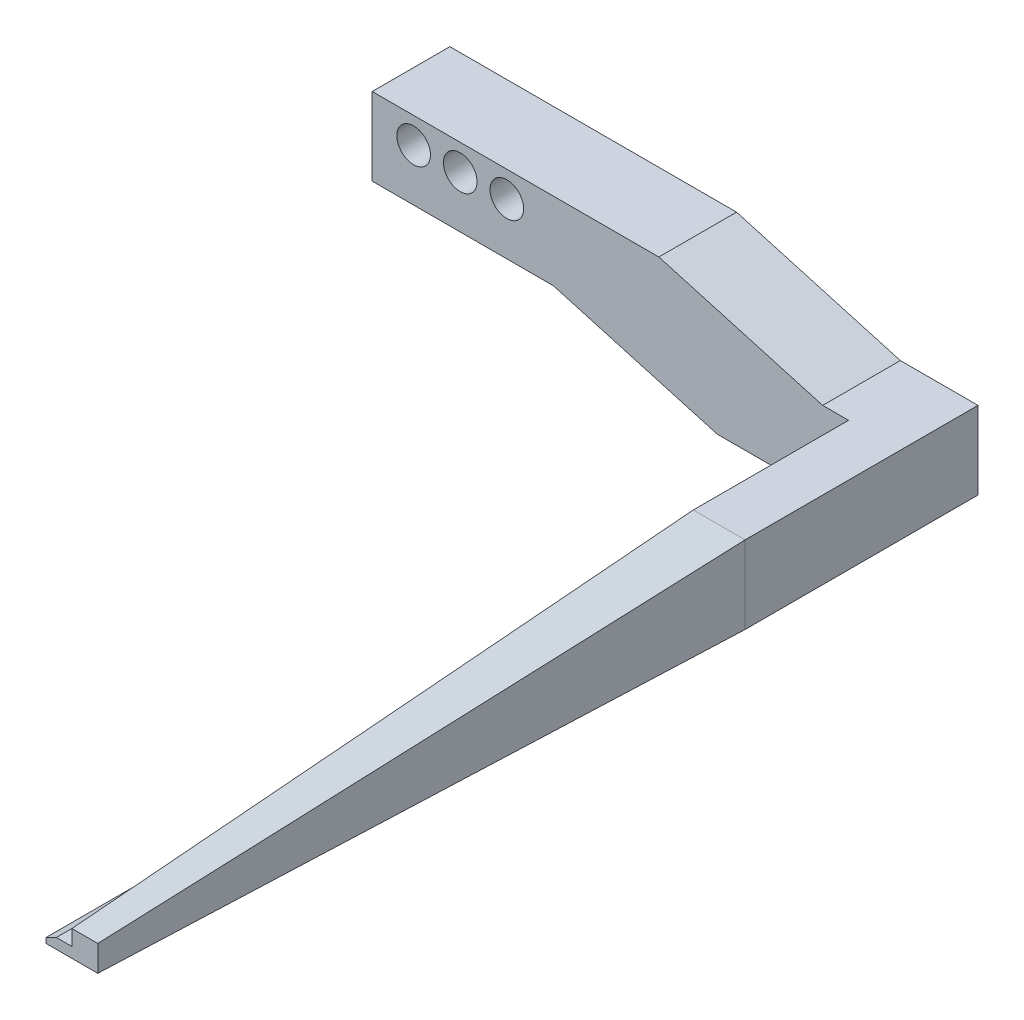
ISO-10303-21;
HEADER;
FILE_DESCRIPTION(('STEP AP214'),'2;1');
FILE_NAME('part.step','',(''),(''),'','','');
FILE_SCHEMA(('AUTOMOTIVE_DESIGN { 1 0 10303 214 1 1 1 1 }'));
ENDSEC;
DATA;
#1=APPLICATION_CONTEXT('core data for automotive mechanical design processes');
#2=APPLICATION_PROTOCOL_DEFINITION('international standard','automotive_design',2000,#1);
#3=PRODUCT_CONTEXT('',#1,'mechanical');
#4=PRODUCT('Part','Part','',(#3));
#5=PRODUCT_RELATED_PRODUCT_CATEGORY('part','',(#4));
#6=PRODUCT_DEFINITION_FORMATION('','',#4);
#7=PRODUCT_DEFINITION_CONTEXT('part definition',#1,'design');
#8=PRODUCT_DEFINITION('design','',#6,#7);
#9=PRODUCT_DEFINITION_SHAPE('','',#8);
#10=(LENGTH_UNIT() NAMED_UNIT(*) SI_UNIT(.MILLI.,.METRE.));
#11=(NAMED_UNIT(*) PLANE_ANGLE_UNIT() SI_UNIT($,.RADIAN.));
#12=(NAMED_UNIT(*) SI_UNIT($,.STERADIAN.) SOLID_ANGLE_UNIT());
#13=UNCERTAINTY_MEASURE_WITH_UNIT(LENGTH_MEASURE(1.E-05),#10,'distance_accuracy_value','');
#14=(GEOMETRIC_REPRESENTATION_CONTEXT(3) GLOBAL_UNCERTAINTY_ASSIGNED_CONTEXT((#13)) GLOBAL_UNIT_ASSIGNED_CONTEXT((#10,
#11,#12)) REPRESENTATION_CONTEXT('',''));
#15=CARTESIAN_POINT('',(0.,0.,0.));
#16=DIRECTION('',(0.,0.,1.));
#17=DIRECTION('',(1.,0.,0.));
#18=AXIS2_PLACEMENT_3D('',#15,#16,#17);
#19=CARTESIAN_POINT('',(18.,-5.,-0.000999999999999265));
#20=DIRECTION('',(0.,0.,1.));
#21=DIRECTION('',(1.,0.,0.));
#22=AXIS2_PLACEMENT_3D('',#19,#20,#21);
#23=CYLINDRICAL_SURFACE('',#22,1.7);
#24=CARTESIAN_POINT('',(18.,-5.,0.));
#25=DIRECTION('',(0.,0.,-1.));
#26=DIRECTION('',(-1.,0.,0.));
#27=AXIS2_PLACEMENT_3D('',#24,#25,#26);
#28=CIRCLE('',#27,1.7);
#29=CARTESIAN_POINT('',(19.7,-5.,0.));
#30=VERTEX_POINT('',#29);
#31=EDGE_CURVE('E306',#30,#30,#28,.F.);
#32=CARTESIAN_POINT('',(18.,-5.,6.));
#33=DIRECTION('',(0.,0.,1.));
#34=DIRECTION('',(1.,0.,0.));
#35=AXIS2_PLACEMENT_3D('',#32,#33,#34);
#36=CIRCLE('',#35,1.7);
#37=CARTESIAN_POINT('',(19.7,-5.,6.));
#38=VERTEX_POINT('',#37);
#39=EDGE_CURVE('E43',#38,#38,#36,.F.);
#40=CARTESIAN_POINT('',(19.7,-5.,0.));
#41=CARTESIAN_POINT('',(19.7,-5.,0.0624999999999999));
#42=CARTESIAN_POINT('',(19.7,-5.,0.125));
#43=CARTESIAN_POINT('',(19.7,-5.,0.25));
#44=CARTESIAN_POINT('',(19.7,-5.,0.3125));
#45=CARTESIAN_POINT('',(19.7,-5.,0.4375));
#46=CARTESIAN_POINT('',(19.7,-5.,0.5));
#47=CARTESIAN_POINT('',(19.7,-5.,0.625));
#48=CARTESIAN_POINT('',(19.7,-5.,0.6875));
#49=CARTESIAN_POINT('',(19.7,-5.,0.8125));
#50=CARTESIAN_POINT('',(19.7,-5.,0.875));
#51=CARTESIAN_POINT('',(19.7,-5.,1.));
#52=CARTESIAN_POINT('',(19.7,-5.,1.0625));
#53=CARTESIAN_POINT('',(19.7,-5.,1.1875));
#54=CARTESIAN_POINT('',(19.7,-5.,1.25));
#55=CARTESIAN_POINT('',(19.7,-5.,1.375));
#56=CARTESIAN_POINT('',(19.7,-5.,1.4375));
#57=CARTESIAN_POINT('',(19.7,-5.,1.5625));
#58=CARTESIAN_POINT('',(19.7,-5.,1.625));
#59=CARTESIAN_POINT('',(19.7,-5.,1.75));
#60=CARTESIAN_POINT('',(19.7,-5.,1.8125));
#61=CARTESIAN_POINT('',(19.7,-5.,1.9375));
#62=CARTESIAN_POINT('',(19.7,-5.,2.));
#63=CARTESIAN_POINT('',(19.7,-5.,2.125));
#64=CARTESIAN_POINT('',(19.7,-5.,2.1875));
#65=CARTESIAN_POINT('',(19.7,-5.,2.3125));
#66=CARTESIAN_POINT('',(19.7,-5.,2.375));
#67=CARTESIAN_POINT('',(19.7,-5.,2.5));
#68=CARTESIAN_POINT('',(19.7,-5.,2.5625));
#69=CARTESIAN_POINT('',(19.7,-5.,2.6875));
#70=CARTESIAN_POINT('',(19.7,-5.,2.75));
#71=CARTESIAN_POINT('',(19.7,-5.,2.875));
#72=CARTESIAN_POINT('',(19.7,-5.,2.9375));
#73=CARTESIAN_POINT('',(19.7,-5.,3.0625));
#74=CARTESIAN_POINT('',(19.7,-5.,3.125));
#75=CARTESIAN_POINT('',(19.7,-5.,3.25));
#76=CARTESIAN_POINT('',(19.7,-5.,3.3125));
#77=CARTESIAN_POINT('',(19.7,-5.,3.4375));
#78=CARTESIAN_POINT('',(19.7,-5.,3.5));
#79=CARTESIAN_POINT('',(19.7,-5.,3.625));
#80=CARTESIAN_POINT('',(19.7,-5.,3.6875));
#81=CARTESIAN_POINT('',(19.7,-5.,3.8125));
#82=CARTESIAN_POINT('',(19.7,-5.,3.875));
#83=CARTESIAN_POINT('',(19.7,-5.,4.));
#84=CARTESIAN_POINT('',(19.7,-5.,4.0625));
#85=CARTESIAN_POINT('',(19.7,-5.,4.1875));
#86=CARTESIAN_POINT('',(19.7,-5.,4.25));
#87=CARTESIAN_POINT('',(19.7,-5.,4.375));
#88=CARTESIAN_POINT('',(19.7,-5.,4.4375));
#89=CARTESIAN_POINT('',(19.7,-5.,4.5625));
#90=CARTESIAN_POINT('',(19.7,-5.,4.625));
#91=CARTESIAN_POINT('',(19.7,-5.,4.75));
#92=CARTESIAN_POINT('',(19.7,-5.,4.8125));
#93=CARTESIAN_POINT('',(19.7,-5.,4.9375));
#94=CARTESIAN_POINT('',(19.7,-5.,5.));
#95=CARTESIAN_POINT('',(19.7,-5.,5.125));
#96=CARTESIAN_POINT('',(19.7,-5.,5.1875));
#97=CARTESIAN_POINT('',(19.7,-5.,5.3125));
#98=CARTESIAN_POINT('',(19.7,-5.,5.375));
#99=CARTESIAN_POINT('',(19.7,-5.,5.5));
#100=CARTESIAN_POINT('',(19.7,-5.,5.5625));
#101=CARTESIAN_POINT('',(19.7,-5.,5.6875));
#102=CARTESIAN_POINT('',(19.7,-5.,5.75));
#103=CARTESIAN_POINT('',(19.7,-5.,5.875));
#104=CARTESIAN_POINT('',(19.7,-5.,5.9375));
#105=CARTESIAN_POINT('',(19.7,-5.,6.));
#106=B_SPLINE_CURVE_WITH_KNOTS('',3,(#40,#41,#42,#43,#44,#45,#46,#47,#48,#49,#50,#51,#52,#53,
#54,#55,#56,#57,#58,#59,#60,#61,#62,#63,#64,#65,#66,#67,#68,#69,#70,#71,#72,#73,#74,#75,#76,#77,
#78,#79,#80,#81,#82,#83,#84,#85,#86,#87,#88,#89,#90,#91,#92,#93,#94,#95,#96,#97,#98,#99,#100,
#101,#102,#103,#104,#105),.UNSPECIFIED.,.F.,.F.,(4,2,2,2,2,2,2,2,2,2,2,2,2,2,2,2,2,2,2,2,2,2,2,
2,2,2,2,2,2,2,2,2,4),(0.,0.1875,0.375,0.5625,0.75,0.9375,1.125,1.3125,1.5,1.6875,1.875,2.0625,
2.25,2.4375,2.625,2.8125,3.,3.1875,3.375,3.5625,3.75,3.9375,4.125,4.3125,4.5,4.6875,4.875,
5.0625,5.25,5.4375,5.625,5.8125,6.),.UNSPECIFIED.);
#107=EDGE_CURVE('BSEAM39',#30,#38,#106,.T.);
#108=ORIENTED_EDGE('',*,*,#31,.F.);
#109=ORIENTED_EDGE('',*,*,#39,.F.);
#110=ORIENTED_EDGE('',*,*,#107,.T.);
#111=ORIENTED_EDGE('',*,*,#107,.F.);
#112=EDGE_LOOP('',(#108,#110,#109,#111));
#113=FACE_BOUND('',#112,.T.);
#114=ADVANCED_FACE('F39',(#113),#23,.F.);
#115=CARTESIAN_POINT('',(27.,-5.,-0.000999999999999265));
#116=DIRECTION('',(0.,0.,1.));
#117=DIRECTION('',(1.,0.,0.));
#118=AXIS2_PLACEMENT_3D('',#115,#116,#117);
#119=CYLINDRICAL_SURFACE('',#118,1.7);
#120=CARTESIAN_POINT('',(27.,-5.,0.));
#121=DIRECTION('',(0.,0.,-1.));
#122=DIRECTION('',(-1.,0.,0.));
#123=AXIS2_PLACEMENT_3D('',#120,#121,#122);
#124=CIRCLE('',#123,1.7);
#125=CARTESIAN_POINT('',(28.7,-5.,0.));
#126=VERTEX_POINT('',#125);
#127=EDGE_CURVE('E311',#126,#126,#124,.F.);
#128=CARTESIAN_POINT('',(27.,-5.,6.));
#129=DIRECTION('',(0.,0.,1.));
#130=DIRECTION('',(1.,0.,0.));
#131=AXIS2_PLACEMENT_3D('',#128,#129,#130);
#132=CIRCLE('',#131,1.7);
#133=CARTESIAN_POINT('',(28.7,-5.,6.));
#134=VERTEX_POINT('',#133);
#135=EDGE_CURVE('E298',#134,#134,#132,.F.);
#136=CARTESIAN_POINT('',(28.7,-5.,0.));
#137=CARTESIAN_POINT('',(28.7,-5.,0.0624999999999999));
#138=CARTESIAN_POINT('',(28.7,-5.,0.125));
#139=CARTESIAN_POINT('',(28.7,-5.,0.25));
#140=CARTESIAN_POINT('',(28.7,-5.,0.3125));
#141=CARTESIAN_POINT('',(28.7,-5.,0.4375));
#142=CARTESIAN_POINT('',(28.7,-5.,0.5));
#143=CARTESIAN_POINT('',(28.7,-5.,0.625));
#144=CARTESIAN_POINT('',(28.7,-5.,0.6875));
#145=CARTESIAN_POINT('',(28.7,-5.,0.8125));
#146=CARTESIAN_POINT('',(28.7,-5.,0.875));
#147=CARTESIAN_POINT('',(28.7,-5.,1.));
#148=CARTESIAN_POINT('',(28.7,-5.,1.0625));
#149=CARTESIAN_POINT('',(28.7,-5.,1.1875));
#150=CARTESIAN_POINT('',(28.7,-5.,1.25));
#151=CARTESIAN_POINT('',(28.7,-5.,1.375));
#152=CARTESIAN_POINT('',(28.7,-5.,1.4375));
#153=CARTESIAN_POINT('',(28.7,-5.,1.5625));
#154=CARTESIAN_POINT('',(28.7,-5.,1.625));
#155=CARTESIAN_POINT('',(28.7,-5.,1.75));
#156=CARTESIAN_POINT('',(28.7,-5.,1.8125));
#157=CARTESIAN_POINT('',(28.7,-5.,1.9375));
#158=CARTESIAN_POINT('',(28.7,-5.,2.));
#159=CARTESIAN_POINT('',(28.7,-5.,2.125));
#160=CARTESIAN_POINT('',(28.7,-5.,2.1875));
#161=CARTESIAN_POINT('',(28.7,-5.,2.3125));
#162=CARTESIAN_POINT('',(28.7,-5.,2.375));
#163=CARTESIAN_POINT('',(28.7,-5.,2.5));
#164=CARTESIAN_POINT('',(28.7,-5.,2.5625));
#165=CARTESIAN_POINT('',(28.7,-5.,2.6875));
#166=CARTESIAN_POINT('',(28.7,-5.,2.75));
#167=CARTESIAN_POINT('',(28.7,-5.,2.875));
#168=CARTESIAN_POINT('',(28.7,-5.,2.9375));
#169=CARTESIAN_POINT('',(28.7,-5.,3.0625));
#170=CARTESIAN_POINT('',(28.7,-5.,3.125));
#171=CARTESIAN_POINT('',(28.7,-5.,3.25));
#172=CARTESIAN_POINT('',(28.7,-5.,3.3125));
#173=CARTESIAN_POINT('',(28.7,-5.,3.4375));
#174=CARTESIAN_POINT('',(28.7,-5.,3.5));
#175=CARTESIAN_POINT('',(28.7,-5.,3.625));
#176=CARTESIAN_POINT('',(28.7,-5.,3.6875));
#177=CARTESIAN_POINT('',(28.7,-5.,3.8125));
#178=CARTESIAN_POINT('',(28.7,-5.,3.875));
#179=CARTESIAN_POINT('',(28.7,-5.,4.));
#180=CARTESIAN_POINT('',(28.7,-5.,4.0625));
#181=CARTESIAN_POINT('',(28.7,-5.,4.1875));
#182=CARTESIAN_POINT('',(28.7,-5.,4.25));
#183=CARTESIAN_POINT('',(28.7,-5.,4.375));
#184=CARTESIAN_POINT('',(28.7,-5.,4.4375));
#185=CARTESIAN_POINT('',(28.7,-5.,4.5625));
#186=CARTESIAN_POINT('',(28.7,-5.,4.625));
#187=CARTESIAN_POINT('',(28.7,-5.,4.75));
#188=CARTESIAN_POINT('',(28.7,-5.,4.8125));
#189=CARTESIAN_POINT('',(28.7,-5.,4.9375));
#190=CARTESIAN_POINT('',(28.7,-5.,5.));
#191=CARTESIAN_POINT('',(28.7,-5.,5.125));
#192=CARTESIAN_POINT('',(28.7,-5.,5.1875));
#193=CARTESIAN_POINT('',(28.7,-5.,5.3125));
#194=CARTESIAN_POINT('',(28.7,-5.,5.375));
#195=CARTESIAN_POINT('',(28.7,-5.,5.5));
#196=CARTESIAN_POINT('',(28.7,-5.,5.5625));
#197=CARTESIAN_POINT('',(28.7,-5.,5.6875));
#198=CARTESIAN_POINT('',(28.7,-5.,5.75));
#199=CARTESIAN_POINT('',(28.7,-5.,5.875));
#200=CARTESIAN_POINT('',(28.7,-5.,5.9375));
#201=CARTESIAN_POINT('',(28.7,-5.,6.));
#202=B_SPLINE_CURVE_WITH_KNOTS('',3,(#136,#137,#138,#139,#140,#141,#142,#143,#144,#145,#146,
#147,#148,#149,#150,#151,#152,#153,#154,#155,#156,#157,#158,#159,#160,#161,#162,#163,#164,#165,
#166,#167,#168,#169,#170,#171,#172,#173,#174,#175,#176,#177,#178,#179,#180,#181,#182,#183,#184,
#185,#186,#187,#188,#189,#190,#191,#192,#193,#194,#195,#196,#197,#198,#199,#200,#201),
.UNSPECIFIED.,.F.,.F.,(4,2,2,2,2,2,2,2,2,2,2,2,2,2,2,2,2,2,2,2,2,2,2,2,2,2,2,2,2,2,2,2,4),(0.,
0.1875,0.375,0.5625,0.75,0.9375,1.125,1.3125,1.5,1.6875,1.875,2.0625,2.25,2.4375,2.625,2.8125,
3.,3.1875,3.375,3.5625,3.75,3.9375,4.125,4.3125,4.5,4.6875,4.875,5.0625,5.25,5.4375,5.625,
5.8125,6.),.UNSPECIFIED.);
#203=EDGE_CURVE('BSEAM415',#126,#134,#202,.T.);
#204=ORIENTED_EDGE('',*,*,#127,.F.);
#205=ORIENTED_EDGE('',*,*,#135,.F.);
#206=ORIENTED_EDGE('',*,*,#203,.T.);
#207=ORIENTED_EDGE('',*,*,#203,.F.);
#208=EDGE_LOOP('',(#204,#206,#205,#207));
#209=FACE_BOUND('',#208,.T.);
#210=ADVANCED_FACE('F415',(#209),#119,.F.);
#211=CARTESIAN_POINT('',(36.,-5.,-0.000999999999999265));
#212=DIRECTION('',(0.,0.,1.));
#213=DIRECTION('',(1.,0.,0.));
#214=AXIS2_PLACEMENT_3D('',#211,#212,#213);
#215=CYLINDRICAL_SURFACE('',#214,1.7);
#216=CARTESIAN_POINT('',(36.,-5.,0.));
#217=DIRECTION('',(0.,0.,-1.));
#218=DIRECTION('',(-1.,0.,0.));
#219=AXIS2_PLACEMENT_3D('',#216,#217,#218);
#220=CIRCLE('',#219,1.7);
#221=CARTESIAN_POINT('',(37.7,-5.,0.));
#222=VERTEX_POINT('',#221);
#223=EDGE_CURVE('E316',#222,#222,#220,.F.);
#224=CARTESIAN_POINT('',(36.,-5.,6.));
#225=DIRECTION('',(0.,0.,1.));
#226=DIRECTION('',(1.,0.,0.));
#227=AXIS2_PLACEMENT_3D('',#224,#225,#226);
#228=CIRCLE('',#227,1.7);
#229=CARTESIAN_POINT('',(37.7,-5.,6.));
#230=VERTEX_POINT('',#229);
#231=EDGE_CURVE('E295',#230,#230,#228,.F.);
#232=CARTESIAN_POINT('',(37.7,-5.,0.));
#233=CARTESIAN_POINT('',(37.7,-5.,0.0624999999999999));
#234=CARTESIAN_POINT('',(37.7,-5.,0.125));
#235=CARTESIAN_POINT('',(37.7,-5.,0.25));
#236=CARTESIAN_POINT('',(37.7,-5.,0.3125));
#237=CARTESIAN_POINT('',(37.7,-5.,0.4375));
#238=CARTESIAN_POINT('',(37.7,-5.,0.5));
#239=CARTESIAN_POINT('',(37.7,-5.,0.625));
#240=CARTESIAN_POINT('',(37.7,-5.,0.6875));
#241=CARTESIAN_POINT('',(37.7,-5.,0.8125));
#242=CARTESIAN_POINT('',(37.7,-5.,0.875));
#243=CARTESIAN_POINT('',(37.7,-5.,1.));
#244=CARTESIAN_POINT('',(37.7,-5.,1.0625));
#245=CARTESIAN_POINT('',(37.7,-5.,1.1875));
#246=CARTESIAN_POINT('',(37.7,-5.,1.25));
#247=CARTESIAN_POINT('',(37.7,-5.,1.375));
#248=CARTESIAN_POINT('',(37.7,-5.,1.4375));
#249=CARTESIAN_POINT('',(37.7,-5.,1.5625));
#250=CARTESIAN_POINT('',(37.7,-5.,1.625));
#251=CARTESIAN_POINT('',(37.7,-5.,1.75));
#252=CARTESIAN_POINT('',(37.7,-5.,1.8125));
#253=CARTESIAN_POINT('',(37.7,-5.,1.9375));
#254=CARTESIAN_POINT('',(37.7,-5.,2.));
#255=CARTESIAN_POINT('',(37.7,-5.,2.125));
#256=CARTESIAN_POINT('',(37.7,-5.,2.1875));
#257=CARTESIAN_POINT('',(37.7,-5.,2.3125));
#258=CARTESIAN_POINT('',(37.7,-5.,2.375));
#259=CARTESIAN_POINT('',(37.7,-5.,2.5));
#260=CARTESIAN_POINT('',(37.7,-5.,2.5625));
#261=CARTESIAN_POINT('',(37.7,-5.,2.6875));
#262=CARTESIAN_POINT('',(37.7,-5.,2.75));
#263=CARTESIAN_POINT('',(37.7,-5.,2.875));
#264=CARTESIAN_POINT('',(37.7,-5.,2.9375));
#265=CARTESIAN_POINT('',(37.7,-5.,3.0625));
#266=CARTESIAN_POINT('',(37.7,-5.,3.125));
#267=CARTESIAN_POINT('',(37.7,-5.,3.25));
#268=CARTESIAN_POINT('',(37.7,-5.,3.3125));
#269=CARTESIAN_POINT('',(37.7,-5.,3.4375));
#270=CARTESIAN_POINT('',(37.7,-5.,3.5));
#271=CARTESIAN_POINT('',(37.7,-5.,3.625));
#272=CARTESIAN_POINT('',(37.7,-5.,3.6875));
#273=CARTESIAN_POINT('',(37.7,-5.,3.8125));
#274=CARTESIAN_POINT('',(37.7,-5.,3.875));
#275=CARTESIAN_POINT('',(37.7,-5.,4.));
#276=CARTESIAN_POINT('',(37.7,-5.,4.0625));
#277=CARTESIAN_POINT('',(37.7,-5.,4.1875));
#278=CARTESIAN_POINT('',(37.7,-5.,4.25));
#279=CARTESIAN_POINT('',(37.7,-5.,4.375));
#280=CARTESIAN_POINT('',(37.7,-5.,4.4375));
#281=CARTESIAN_POINT('',(37.7,-5.,4.5625));
#282=CARTESIAN_POINT('',(37.7,-5.,4.625));
#283=CARTESIAN_POINT('',(37.7,-5.,4.75));
#284=CARTESIAN_POINT('',(37.7,-5.,4.8125));
#285=CARTESIAN_POINT('',(37.7,-5.,4.9375));
#286=CARTESIAN_POINT('',(37.7,-5.,5.));
#287=CARTESIAN_POINT('',(37.7,-5.,5.125));
#288=CARTESIAN_POINT('',(37.7,-5.,5.1875));
#289=CARTESIAN_POINT('',(37.7,-5.,5.3125));
#290=CARTESIAN_POINT('',(37.7,-5.,5.375));
#291=CARTESIAN_POINT('',(37.7,-5.,5.5));
#292=CARTESIAN_POINT('',(37.7,-5.,5.5625));
#293=CARTESIAN_POINT('',(37.7,-5.,5.6875));
#294=CARTESIAN_POINT('',(37.7,-5.,5.75));
#295=CARTESIAN_POINT('',(37.7,-5.,5.875));
#296=CARTESIAN_POINT('',(37.7,-5.,5.9375));
#297=CARTESIAN_POINT('',(37.7,-5.,6.));
#298=B_SPLINE_CURVE_WITH_KNOTS('',3,(#232,#233,#234,#235,#236,#237,#238,#239,#240,#241,#242,
#243,#244,#245,#246,#247,#248,#249,#250,#251,#252,#253,#254,#255,#256,#257,#258,#259,#260,#261,
#262,#263,#264,#265,#266,#267,#268,#269,#270,#271,#272,#273,#274,#275,#276,#277,#278,#279,#280,
#281,#282,#283,#284,#285,#286,#287,#288,#289,#290,#291,#292,#293,#294,#295,#296,#297),
.UNSPECIFIED.,.F.,.F.,(4,2,2,2,2,2,2,2,2,2,2,2,2,2,2,2,2,2,2,2,2,2,2,2,2,2,2,2,2,2,2,2,4),(0.,
0.1875,0.375,0.5625,0.75,0.9375,1.125,1.3125,1.5,1.6875,1.875,2.0625,2.25,2.4375,2.625,2.8125,
3.,3.1875,3.375,3.5625,3.75,3.9375,4.125,4.3125,4.5,4.6875,4.875,5.0625,5.25,5.4375,5.625,
5.8125,6.),.UNSPECIFIED.);
#299=EDGE_CURVE('BSEAM421',#222,#230,#298,.T.);
#300=ORIENTED_EDGE('',*,*,#223,.F.);
#301=ORIENTED_EDGE('',*,*,#231,.F.);
#302=ORIENTED_EDGE('',*,*,#299,.T.);
#303=ORIENTED_EDGE('',*,*,#299,.F.);
#304=EDGE_LOOP('',(#300,#302,#301,#303));
#305=FACE_BOUND('',#304,.T.);
#306=ADVANCED_FACE('F421',(#305),#215,.F.);
#307=CARTESIAN_POINT('',(0.,0.,15.));
#308=DIRECTION('',(0.,0.,-1.));
#309=DIRECTION('',(-1.,0.,0.));
#310=AXIS2_PLACEMENT_3D('',#307,#308,#309);
#311=PLANE('',#310);
#312=CARTESIAN_POINT('',(18.,-5.,15.));
#313=DIRECTION('',(0.,0.,1.));
#314=DIRECTION('',(1.,0.,0.));
#315=AXIS2_PLACEMENT_3D('',#312,#313,#314);
#316=CIRCLE('',#315,3.25);
#317=CARTESIAN_POINT('',(21.25,-5.,15.));
#318=VERTEX_POINT('',#317);
#319=EDGE_CURVE('E338',#318,#318,#316,.T.);
#320=ORIENTED_EDGE('',*,*,#319,.F.);
#321=EDGE_LOOP('',(#320));
#322=FACE_BOUND('',#321,.T.);
#323=CARTESIAN_POINT('',(27.,-5.,15.));
#324=DIRECTION('',(0.,0.,1.));
#325=DIRECTION('',(1.,0.,0.));
#326=AXIS2_PLACEMENT_3D('',#323,#324,#325);
#327=CIRCLE('',#326,3.25);
#328=CARTESIAN_POINT('',(30.25,-5.,15.));
#329=VERTEX_POINT('',#328);
#330=EDGE_CURVE('E330',#329,#329,#327,.T.);
#331=ORIENTED_EDGE('',*,*,#330,.F.);
#332=EDGE_LOOP('',(#331));
#333=FACE_BOUND('',#332,.T.);
#334=CARTESIAN_POINT('',(36.,-5.,15.));
#335=DIRECTION('',(0.,0.,1.));
#336=DIRECTION('',(1.,0.,0.));
#337=AXIS2_PLACEMENT_3D('',#334,#335,#336);
#338=CIRCLE('',#337,3.25);
#339=CARTESIAN_POINT('',(39.25,-5.,15.));
#340=VERTEX_POINT('',#339);
#341=EDGE_CURVE('E322',#340,#340,#338,.T.);
#342=ORIENTED_EDGE('',*,*,#341,.F.);
#343=EDGE_LOOP('',(#342));
#344=FACE_BOUND('',#343,.T.);
#345=DIRECTION('',(0.,-1.,0.));
#346=VECTOR('',#345,1.);
#347=CARTESIAN_POINT('',(97.,-24.,15.));
#348=LINE('',#347,#346);
#349=CARTESIAN_POINT('',(97.,-23.,15.));
#350=VERTEX_POINT('',#349);
#351=CARTESIAN_POINT('',(97.,-24.,15.));
#352=VERTEX_POINT('',#351);
#353=EDGE_CURVE('E65',#350,#352,#348,.T.);
#354=ORIENTED_EDGE('',*,*,#353,.F.);
#355=DIRECTION('',(-0.894427190999916,-0.447213595499958,0.));
#356=VECTOR('',#355,1.);
#357=CARTESIAN_POINT('',(97.,-23.,15.));
#358=LINE('',#357,#356);
#359=CARTESIAN_POINT('',(99.,-22.,15.));
#360=VERTEX_POINT('',#359);
#361=EDGE_CURVE('E198',#360,#350,#358,.T.);
#362=ORIENTED_EDGE('',*,*,#361,.F.);
#363=DIRECTION('',(-1.,0.,0.));
#364=VECTOR('',#363,1.);
#365=CARTESIAN_POINT('',(99.,-22.,15.));
#366=LINE('',#365,#364);
#367=CARTESIAN_POINT('',(102.,-22.,15.));
#368=VERTEX_POINT('',#367);
#369=EDGE_CURVE('E174',#368,#360,#366,.T.);
#370=ORIENTED_EDGE('',*,*,#369,.F.);
#371=DIRECTION('',(0.,-1.,0.));
#372=VECTOR('',#371,1.);
#373=CARTESIAN_POINT('',(102.,-22.,15.));
#374=LINE('',#373,#372);
#375=CARTESIAN_POINT('',(102.,-9.,15.));
#376=VERTEX_POINT('',#375);
#377=EDGE_CURVE('E168',#376,#368,#374,.T.);
#378=ORIENTED_EDGE('',*,*,#377,.F.);
#379=DIRECTION('',(-1.,0.,0.));
#380=VECTOR('',#379,1.);
#381=CARTESIAN_POINT('',(97.,-9.,15.));
#382=LINE('',#381,#380);
#383=CARTESIAN_POINT('',(97.,-9.,15.));
#384=VERTEX_POINT('',#383);
#385=EDGE_CURVE('E236',#376,#384,#382,.T.);
#386=ORIENTED_EDGE('',*,*,#385,.T.);
#387=DIRECTION('',(-0.961833729003338,0.273634569730384,0.));
#388=VECTOR('',#387,1.);
#389=CARTESIAN_POINT('',(65.3647297577955,0.,15.));
#390=LINE('',#389,#388);
#391=CARTESIAN_POINT('',(65.3647297577955,0.,15.));
#392=VERTEX_POINT('',#391);
#393=EDGE_CURVE('E239',#384,#392,#390,.T.);
#394=ORIENTED_EDGE('',*,*,#393,.T.);
#395=DIRECTION('',(-1.,0.,0.));
#396=VECTOR('',#395,1.);
#397=CARTESIAN_POINT('',(10.,0.,15.));
#398=LINE('',#397,#396);
#399=CARTESIAN_POINT('',(10.,0.,15.));
#400=VERTEX_POINT('',#399);
#401=EDGE_CURVE('E242',#392,#400,#398,.T.);
#402=ORIENTED_EDGE('',*,*,#401,.T.);
#403=DIRECTION('',(0.,-1.,0.));
#404=VECTOR('',#403,1.);
#405=CARTESIAN_POINT('',(10.,-15.,15.));
#406=LINE('',#405,#404);
#407=CARTESIAN_POINT('',(10.,-15.,15.));
#408=VERTEX_POINT('',#407);
#409=EDGE_CURVE('E222',#400,#408,#406,.T.);
#410=ORIENTED_EDGE('',*,*,#409,.T.);
#411=DIRECTION('',(1.,0.,0.));
#412=VECTOR('',#411,1.);
#413=CARTESIAN_POINT('',(45.,-15.,15.));
#414=LINE('',#413,#412);
#415=CARTESIAN_POINT('',(45.,-15.,15.));
#416=VERTEX_POINT('',#415);
#417=EDGE_CURVE('E226',#408,#416,#414,.T.);
#418=ORIENTED_EDGE('',*,*,#417,.T.);
#419=DIRECTION('',(0.961833729003338,-0.273634569730384,0.));
#420=VECTOR('',#419,1.);
#421=CARTESIAN_POINT('',(76.6352702422045,-24.,15.));
#422=LINE('',#421,#420);
#423=CARTESIAN_POINT('',(76.6352702422045,-24.,15.));
#424=VERTEX_POINT('',#423);
#425=EDGE_CURVE('E230',#416,#424,#422,.T.);
#426=ORIENTED_EDGE('',*,*,#425,.T.);
#427=DIRECTION('',(1.,0.,0.));
#428=VECTOR('',#427,1.);
#429=CARTESIAN_POINT('',(112.,-24.,15.));
#430=LINE('',#429,#428);
#431=EDGE_CURVE('E233',#424,#352,#430,.T.);
#432=ORIENTED_EDGE('',*,*,#431,.T.);
#433=EDGE_LOOP('',(#354,#362,#370,#378,#386,#394,#402,#410,#418,#426,#432));
#434=FACE_BOUND('',#433,.T.);
#435=ADVANCED_FACE('F375',(#322,#333,#344,#434),#311,.F.);
#436=CARTESIAN_POINT('',(10.,-15.,15.));
#437=DIRECTION('',(1.,0.,0.));
#438=DIRECTION('',(0.,1.,0.));
#439=AXIS2_PLACEMENT_3D('',#436,#437,#438);
#440=PLANE('',#439);
#441=DIRECTION('',(0.,-1.,0.));
#442=VECTOR('',#441,1.);
#443=CARTESIAN_POINT('',(10.,-15.,0.));
#444=LINE('',#443,#442);
#445=CARTESIAN_POINT('',(10.,0.,0.));
#446=VERTEX_POINT('',#445);
#447=CARTESIAN_POINT('',(10.,-15.,0.));
#448=VERTEX_POINT('',#447);
#449=EDGE_CURVE('E221',#446,#448,#444,.T.);
#450=ORIENTED_EDGE('',*,*,#449,.T.);
#451=DIRECTION('',(0.,0.,-1.));
#452=VECTOR('',#451,1.);
#453=CARTESIAN_POINT('',(10.,-15.,15.));
#454=LINE('',#453,#452);
#455=EDGE_CURVE('E11',#408,#448,#454,.T.);
#456=ORIENTED_EDGE('',*,*,#455,.F.);
#457=ORIENTED_EDGE('',*,*,#409,.F.);
#458=DIRECTION('',(0.,0.,-1.));
#459=VECTOR('',#458,1.);
#460=CARTESIAN_POINT('',(10.,0.,15.));
#461=LINE('',#460,#459);
#462=EDGE_CURVE('E245',#400,#446,#461,.T.);
#463=ORIENTED_EDGE('',*,*,#462,.T.);
#464=EDGE_LOOP('',(#450,#456,#457,#463));
#465=FACE_BOUND('',#464,.T.);
#466=ADVANCED_FACE('F41',(#465),#440,.F.);
#467=CARTESIAN_POINT('',(45.,-15.,15.));
#468=DIRECTION('',(0.,1.,0.));
#469=DIRECTION('',(0.,0.,1.));
#470=AXIS2_PLACEMENT_3D('',#467,#468,#469);
#471=PLANE('',#470);
#472=DIRECTION('',(1.,0.,0.));
#473=VECTOR('',#472,1.);
#474=CARTESIAN_POINT('',(45.,-15.,0.));
#475=LINE('',#474,#473);
#476=CARTESIAN_POINT('',(45.,-15.,0.));
#477=VERTEX_POINT('',#476);
#478=EDGE_CURVE('E249',#448,#477,#475,.T.);
#479=ORIENTED_EDGE('',*,*,#478,.T.);
#480=DIRECTION('',(0.,0.,-1.));
#481=VECTOR('',#480,1.);
#482=CARTESIAN_POINT('',(45.,-15.,15.));
#483=LINE('',#482,#481);
#484=EDGE_CURVE('E49',#416,#477,#483,.T.);
#485=ORIENTED_EDGE('',*,*,#484,.F.);
#486=ORIENTED_EDGE('',*,*,#417,.F.);
#487=ORIENTED_EDGE('',*,*,#455,.T.);
#488=EDGE_LOOP('',(#479,#485,#486,#487));
#489=FACE_BOUND('',#488,.T.);
#490=ADVANCED_FACE('F400',(#489),#471,.F.);
#491=CARTESIAN_POINT('',(76.6352702422045,-24.,15.));
#492=DIRECTION('',(0.273634569730384,0.961833729003338,0.));
#493=DIRECTION('',(-0.961833729003339,0.273634569730384,0.));
#494=AXIS2_PLACEMENT_3D('',#491,#492,#493);
#495=PLANE('',#494);
#496=DIRECTION('',(0.961833729003338,-0.273634569730384,0.));
#497=VECTOR('',#496,1.);
#498=CARTESIAN_POINT('',(76.6352702422045,-24.,0.));
#499=LINE('',#498,#497);
#500=CARTESIAN_POINT('',(76.6352702422045,-24.,0.));
#501=VERTEX_POINT('',#500);
#502=EDGE_CURVE('E252',#477,#501,#499,.T.);
#503=ORIENTED_EDGE('',*,*,#502,.T.);
#504=DIRECTION('',(0.,0.,-1.));
#505=VECTOR('',#504,1.);
#506=CARTESIAN_POINT('',(76.6352702422045,-24.,15.));
#507=LINE('',#506,#505);
#508=EDGE_CURVE('E288',#424,#501,#507,.T.);
#509=ORIENTED_EDGE('',*,*,#508,.F.);
#510=ORIENTED_EDGE('',*,*,#425,.F.);
#511=ORIENTED_EDGE('',*,*,#484,.T.);
#512=EDGE_LOOP('',(#503,#509,#510,#511));
#513=FACE_BOUND('',#512,.T.);
#514=ADVANCED_FACE('F397',(#513),#495,.F.);
#515=CARTESIAN_POINT('',(112.,-24.,15.));
#516=DIRECTION('',(0.,1.,0.));
#517=DIRECTION('',(-1.,0.,0.));
#518=AXIS2_PLACEMENT_3D('',#515,#516,#517);
#519=PLANE('',#518);
#520=DIRECTION('',(0.,0.,-1.));
#521=VECTOR('',#520,1.);
#522=CARTESIAN_POINT('',(112.,-24.,15.));
#523=LINE('',#522,#521);
#524=CARTESIAN_POINT('',(112.,-24.,45.));
#525=VERTEX_POINT('',#524);
#526=CARTESIAN_POINT('',(112.,-24.,0.));
#527=VERTEX_POINT('',#526);
#528=EDGE_CURVE('E285',#525,#527,#523,.T.);
#529=ORIENTED_EDGE('',*,*,#528,.F.);
#530=DIRECTION('',(0.0416305447121813,0.,-0.999133073092352));
#531=VECTOR('',#530,1.);
#532=CARTESIAN_POINT('',(107.,-24.,165.));
#533=LINE('',#532,#531);
#534=CARTESIAN_POINT('',(107.,-24.,165.));
#535=VERTEX_POINT('',#534);
#536=EDGE_CURVE('E161',#535,#525,#533,.T.);
#537=ORIENTED_EDGE('',*,*,#536,.F.);
#538=DIRECTION('',(1.,0.,0.));
#539=VECTOR('',#538,1.);
#540=CARTESIAN_POINT('',(112.,-24.,165.));
#541=LINE('',#540,#539);
#542=CARTESIAN_POINT('',(97.,-24.,165.));
#543=VERTEX_POINT('',#542);
#544=EDGE_CURVE('E159',#543,#535,#541,.T.);
#545=ORIENTED_EDGE('',*,*,#544,.F.);
#546=DIRECTION('',(0.,0.,-1.));
#547=VECTOR('',#546,1.);
#548=CARTESIAN_POINT('',(97.,-24.,165.));
#549=LINE('',#548,#547);
#550=EDGE_CURVE('E193',#543,#352,#549,.T.);
#551=ORIENTED_EDGE('',*,*,#550,.T.);
#552=ORIENTED_EDGE('',*,*,#431,.F.);
#553=ORIENTED_EDGE('',*,*,#508,.T.);
#554=DIRECTION('',(1.,0.,0.));
#555=VECTOR('',#554,1.);
#556=CARTESIAN_POINT('',(112.,-24.,0.));
#557=LINE('',#556,#555);
#558=EDGE_CURVE('E255',#501,#527,#557,.T.);
#559=ORIENTED_EDGE('',*,*,#558,.T.);
#560=EDGE_LOOP('',(#529,#537,#545,#551,#552,#553,#559));
#561=FACE_BOUND('',#560,.T.);
#562=ADVANCED_FACE('F353',(#561),#519,.F.);
#563=CARTESIAN_POINT('',(112.,-9.,15.));
#564=DIRECTION('',(-1.,0.,0.));
#565=DIRECTION('',(0.,0.,1.));
#566=AXIS2_PLACEMENT_3D('',#563,#564,#565);
#567=PLANE('',#566);
#568=DIRECTION('',(0.,0.,-1.));
#569=VECTOR('',#568,1.);
#570=CARTESIAN_POINT('',(112.,-9.,15.));
#571=LINE('',#570,#569);
#572=CARTESIAN_POINT('',(112.,-9.,45.));
#573=VERTEX_POINT('',#572);
#574=CARTESIAN_POINT('',(112.,-9.,0.));
#575=VERTEX_POINT('',#574);
#576=EDGE_CURVE('E282',#573,#575,#571,.T.);
#577=ORIENTED_EDGE('',*,*,#576,.F.);
#578=DIRECTION('',(0.,1.,0.));
#579=VECTOR('',#578,1.);
#580=CARTESIAN_POINT('',(112.,-24.001,45.));
#581=LINE('',#580,#579);
#582=EDGE_CURVE('E151',#525,#573,#581,.T.);
#583=ORIENTED_EDGE('',*,*,#582,.F.);
#584=ORIENTED_EDGE('',*,*,#528,.T.);
#585=DIRECTION('',(0.,1.,0.));
#586=VECTOR('',#585,1.);
#587=CARTESIAN_POINT('',(112.,-9.,0.));
#588=LINE('',#587,#586);
#589=EDGE_CURVE('E259',#527,#575,#588,.T.);
#590=ORIENTED_EDGE('',*,*,#589,.T.);
#591=EDGE_LOOP('',(#577,#583,#584,#590));
#592=FACE_BOUND('',#591,.T.);
#593=ADVANCED_FACE('F352',(#592),#567,.F.);
#594=CARTESIAN_POINT('',(97.,-9.,15.));
#595=DIRECTION('',(0.,-1.,0.));
#596=DIRECTION('',(0.,0.,-1.));
#597=AXIS2_PLACEMENT_3D('',#594,#595,#596);
#598=PLANE('',#597);
#599=DIRECTION('',(0.,0.,-1.));
#600=VECTOR('',#599,1.);
#601=CARTESIAN_POINT('',(102.,-9.,165.));
#602=LINE('',#601,#600);
#603=CARTESIAN_POINT('',(102.,-9.,45.));
#604=VERTEX_POINT('',#603);
#605=EDGE_CURVE('E218',#604,#376,#602,.T.);
#606=ORIENTED_EDGE('',*,*,#605,.F.);
#607=DIRECTION('',(-1.,0.,0.));
#608=VECTOR('',#607,1.);
#609=CARTESIAN_POINT('',(112.001,-9.,45.));
#610=LINE('',#609,#608);
#611=EDGE_CURVE('E169',#573,#604,#610,.T.);
#612=ORIENTED_EDGE('',*,*,#611,.F.);
#613=ORIENTED_EDGE('',*,*,#576,.T.);
#614=DIRECTION('',(-1.,0.,0.));
#615=VECTOR('',#614,1.);
#616=CARTESIAN_POINT('',(97.,-9.,0.));
#617=LINE('',#616,#615);
#618=CARTESIAN_POINT('',(97.,-9.,0.));
#619=VERTEX_POINT('',#618);
#620=EDGE_CURVE('E263',#575,#619,#617,.T.);
#621=ORIENTED_EDGE('',*,*,#620,.T.);
#622=DIRECTION('',(0.,0.,-1.));
#623=VECTOR('',#622,1.);
#624=CARTESIAN_POINT('',(97.,-9.,15.));
#625=LINE('',#624,#623);
#626=EDGE_CURVE('E278',#384,#619,#625,.T.);
#627=ORIENTED_EDGE('',*,*,#626,.F.);
#628=ORIENTED_EDGE('',*,*,#385,.F.);
#629=EDGE_LOOP('',(#606,#612,#613,#621,#627,#628));
#630=FACE_BOUND('',#629,.T.);
#631=ADVANCED_FACE('F368',(#630),#598,.F.);
#632=CARTESIAN_POINT('',(65.3647297577955,0.,15.));
#633=DIRECTION('',(-0.273634569730384,-0.961833729003338,0.));
#634=DIRECTION('',(0.961833729003338,-0.273634569730384,0.));
#635=AXIS2_PLACEMENT_3D('',#632,#633,#634);
#636=PLANE('',#635);
#637=DIRECTION('',(-0.961833729003338,0.273634569730384,0.));
#638=VECTOR('',#637,1.);
#639=CARTESIAN_POINT('',(65.3647297577955,0.,0.));
#640=LINE('',#639,#638);
#641=CARTESIAN_POINT('',(65.3647297577955,0.,0.));
#642=VERTEX_POINT('',#641);
#643=EDGE_CURVE('E266',#619,#642,#640,.T.);
#644=ORIENTED_EDGE('',*,*,#643,.T.);
#645=DIRECTION('',(0.,0.,-1.));
#646=VECTOR('',#645,1.);
#647=CARTESIAN_POINT('',(65.3647297577955,0.,15.));
#648=LINE('',#647,#646);
#649=EDGE_CURVE('E274',#392,#642,#648,.T.);
#650=ORIENTED_EDGE('',*,*,#649,.F.);
#651=ORIENTED_EDGE('',*,*,#393,.F.);
#652=ORIENTED_EDGE('',*,*,#626,.T.);
#653=EDGE_LOOP('',(#644,#650,#651,#652));
#654=FACE_BOUND('',#653,.T.);
#655=ADVANCED_FACE('F372',(#654),#636,.F.);
#656=CARTESIAN_POINT('',(10.,0.,15.));
#657=DIRECTION('',(0.,-1.,0.));
#658=DIRECTION('',(0.,0.,-1.));
#659=AXIS2_PLACEMENT_3D('',#656,#657,#658);
#660=PLANE('',#659);
#661=DIRECTION('',(-1.,0.,0.));
#662=VECTOR('',#661,1.);
#663=CARTESIAN_POINT('',(10.,0.,0.));
#664=LINE('',#663,#662);
#665=EDGE_CURVE('E227',#642,#446,#664,.T.);
#666=ORIENTED_EDGE('',*,*,#665,.T.);
#667=ORIENTED_EDGE('',*,*,#462,.F.);
#668=ORIENTED_EDGE('',*,*,#401,.F.);
#669=ORIENTED_EDGE('',*,*,#649,.T.);
#670=EDGE_LOOP('',(#666,#667,#668,#669));
#671=FACE_BOUND('',#670,.T.);
#672=ADVANCED_FACE('F404',(#671),#660,.F.);
#673=CARTESIAN_POINT('',(0.,0.,0.));
#674=DIRECTION('',(0.,0.,-1.));
#675=DIRECTION('',(-1.,0.,0.));
#676=AXIS2_PLACEMENT_3D('',#673,#674,#675);
#677=PLANE('',#676);
#678=ORIENTED_EDGE('',*,*,#223,.T.);
#679=EDGE_LOOP('',(#678));
#680=FACE_BOUND('',#679,.T.);
#681=ORIENTED_EDGE('',*,*,#127,.T.);
#682=EDGE_LOOP('',(#681));
#683=FACE_BOUND('',#682,.T.);
#684=ORIENTED_EDGE('',*,*,#31,.T.);
#685=EDGE_LOOP('',(#684));
#686=FACE_BOUND('',#685,.T.);
#687=ORIENTED_EDGE('',*,*,#449,.F.);
#688=ORIENTED_EDGE('',*,*,#665,.F.);
#689=ORIENTED_EDGE('',*,*,#643,.F.);
#690=ORIENTED_EDGE('',*,*,#620,.F.);
#691=ORIENTED_EDGE('',*,*,#589,.F.);
#692=ORIENTED_EDGE('',*,*,#558,.F.);
#693=ORIENTED_EDGE('',*,*,#502,.F.);
#694=ORIENTED_EDGE('',*,*,#478,.F.);
#695=EDGE_LOOP('',(#687,#688,#689,#690,#691,#692,#693,#694));
#696=FACE_BOUND('',#695,.T.);
#697=ADVANCED_FACE('F362',(#680,#683,#686,#696),#677,.T.);
#698=CARTESIAN_POINT('',(102.,-22.,165.));
#699=DIRECTION('',(1.,0.,0.));
#700=DIRECTION('',(0.,0.,-1.));
#701=AXIS2_PLACEMENT_3D('',#698,#699,#700);
#702=PLANE('',#701);
#703=DIRECTION('',(0.,-1.,0.));
#704=VECTOR('',#703,1.);
#705=CARTESIAN_POINT('',(102.,-22.,165.));
#706=LINE('',#705,#704);
#707=CARTESIAN_POINT('',(102.,-19.,165.));
#708=VERTEX_POINT('',#707);
#709=CARTESIAN_POINT('',(102.,-22.,165.));
#710=VERTEX_POINT('',#709);
#711=EDGE_CURVE('E180',#708,#710,#706,.T.);
#712=ORIENTED_EDGE('',*,*,#711,.F.);
#713=DIRECTION('',(0.,-0.08304547985374,0.99654575824488));
#714=VECTOR('',#713,1.);
#715=CARTESIAN_POINT('',(102.,-19.,165.));
#716=LINE('',#715,#714);
#717=EDGE_CURVE('E165',#604,#708,#716,.T.);
#718=ORIENTED_EDGE('',*,*,#717,.F.);
#719=ORIENTED_EDGE('',*,*,#605,.T.);
#720=ORIENTED_EDGE('',*,*,#377,.T.);
#721=DIRECTION('',(0.,0.,-1.));
#722=VECTOR('',#721,1.);
#723=CARTESIAN_POINT('',(102.,-22.,165.));
#724=LINE('',#723,#722);
#725=EDGE_CURVE('E214',#710,#368,#724,.T.);
#726=ORIENTED_EDGE('',*,*,#725,.F.);
#727=EDGE_LOOP('',(#712,#718,#719,#720,#726));
#728=FACE_BOUND('',#727,.T.);
#729=ADVANCED_FACE('F379',(#728),#702,.F.);
#730=CARTESIAN_POINT('',(99.,-22.,165.));
#731=DIRECTION('',(0.,-1.,0.));
#732=DIRECTION('',(0.,0.,-1.));
#733=AXIS2_PLACEMENT_3D('',#730,#731,#732);
#734=PLANE('',#733);
#735=ORIENTED_EDGE('',*,*,#369,.T.);
#736=DIRECTION('',(0.,0.,-1.));
#737=VECTOR('',#736,1.);
#738=CARTESIAN_POINT('',(99.,-22.,165.));
#739=LINE('',#738,#737);
#740=CARTESIAN_POINT('',(99.,-22.,165.));
#741=VERTEX_POINT('',#740);
#742=EDGE_CURVE('E210',#741,#360,#739,.T.);
#743=ORIENTED_EDGE('',*,*,#742,.F.);
#744=DIRECTION('',(-1.,0.,0.));
#745=VECTOR('',#744,1.);
#746=CARTESIAN_POINT('',(99.,-22.,165.));
#747=LINE('',#746,#745);
#748=EDGE_CURVE('E183',#710,#741,#747,.T.);
#749=ORIENTED_EDGE('',*,*,#748,.F.);
#750=ORIENTED_EDGE('',*,*,#725,.T.);
#751=EDGE_LOOP('',(#735,#743,#749,#750));
#752=FACE_BOUND('',#751,.T.);
#753=ADVANCED_FACE('F387',(#752),#734,.F.);
#754=CARTESIAN_POINT('',(97.,-23.,165.));
#755=DIRECTION('',(0.447213595499958,-0.894427190999916,0.));
#756=DIRECTION('',(0.894427190999916,0.447213595499958,0.));
#757=AXIS2_PLACEMENT_3D('',#754,#755,#756);
#758=PLANE('',#757);
#759=ORIENTED_EDGE('',*,*,#361,.T.);
#760=DIRECTION('',(0.,0.,-1.));
#761=VECTOR('',#760,1.);
#762=CARTESIAN_POINT('',(97.,-23.,165.));
#763=LINE('',#762,#761);
#764=CARTESIAN_POINT('',(97.,-23.,165.));
#765=VERTEX_POINT('',#764);
#766=EDGE_CURVE('E206',#765,#350,#763,.T.);
#767=ORIENTED_EDGE('',*,*,#766,.F.);
#768=DIRECTION('',(-0.894427190999916,-0.447213595499958,0.));
#769=VECTOR('',#768,1.);
#770=CARTESIAN_POINT('',(97.,-23.,165.));
#771=LINE('',#770,#769);
#772=EDGE_CURVE('E186',#741,#765,#771,.T.);
#773=ORIENTED_EDGE('',*,*,#772,.F.);
#774=ORIENTED_EDGE('',*,*,#742,.T.);
#775=EDGE_LOOP('',(#759,#767,#773,#774));
#776=FACE_BOUND('',#775,.T.);
#777=ADVANCED_FACE('F389',(#776),#758,.F.);
#778=CARTESIAN_POINT('',(97.,-24.,165.));
#779=DIRECTION('',(1.,0.,0.));
#780=DIRECTION('',(0.,0.,-1.));
#781=AXIS2_PLACEMENT_3D('',#778,#779,#780);
#782=PLANE('',#781);
#783=ORIENTED_EDGE('',*,*,#353,.T.);
#784=ORIENTED_EDGE('',*,*,#550,.F.);
#785=DIRECTION('',(0.,-1.,0.));
#786=VECTOR('',#785,1.);
#787=CARTESIAN_POINT('',(97.,-24.,165.));
#788=LINE('',#787,#786);
#789=EDGE_CURVE('E189',#765,#543,#788,.T.);
#790=ORIENTED_EDGE('',*,*,#789,.F.);
#791=ORIENTED_EDGE('',*,*,#766,.T.);
#792=EDGE_LOOP('',(#783,#784,#790,#791));
#793=FACE_BOUND('',#792,.T.);
#794=ADVANCED_FACE('F393',(#793),#782,.F.);
#795=CARTESIAN_POINT('',(0.,0.,165.));
#796=DIRECTION('',(0.,0.,-1.));
#797=DIRECTION('',(-1.,0.,0.));
#798=AXIS2_PLACEMENT_3D('',#795,#796,#797);
#799=PLANE('',#798);
#800=ORIENTED_EDGE('',*,*,#544,.T.);
#801=DIRECTION('',(0.,1.,0.));
#802=VECTOR('',#801,1.);
#803=CARTESIAN_POINT('',(107.,-24.001,165.));
#804=LINE('',#803,#802);
#805=CARTESIAN_POINT('',(107.,-19.,165.));
#806=VERTEX_POINT('',#805);
#807=EDGE_CURVE('E148',#535,#806,#804,.T.);
#808=ORIENTED_EDGE('',*,*,#807,.T.);
#809=DIRECTION('',(-1.,0.,0.));
#810=VECTOR('',#809,1.);
#811=CARTESIAN_POINT('',(112.001,-19.,165.));
#812=LINE('',#811,#810);
#813=EDGE_CURVE('E57',#806,#708,#812,.T.);
#814=ORIENTED_EDGE('',*,*,#813,.T.);
#815=ORIENTED_EDGE('',*,*,#711,.T.);
#816=ORIENTED_EDGE('',*,*,#748,.T.);
#817=ORIENTED_EDGE('',*,*,#772,.T.);
#818=ORIENTED_EDGE('',*,*,#789,.T.);
#819=EDGE_LOOP('',(#800,#808,#814,#815,#816,#817,#818));
#820=FACE_BOUND('',#819,.T.);
#821=ADVANCED_FACE('F157',(#820),#799,.F.);
#822=CARTESIAN_POINT('',(112.001,-19.,165.));
#823=DIRECTION('',(0.,-0.99654575824488,-0.08304547985374));
#824=DIRECTION('',(0.,0.08304547985374,-0.99654575824488));
#825=AXIS2_PLACEMENT_3D('',#822,#823,#824);
#826=PLANE('',#825);
#827=ORIENTED_EDGE('',*,*,#813,.F.);
#828=DIRECTION('',(-0.0414869906822511,-0.0829739813645023,0.995687776374027));
#829=VECTOR('',#828,1.);
#830=CARTESIAN_POINT('',(106.982784853701,-19.034430292599,165.413163511188));
#831=LINE('',#830,#829);
#832=EDGE_CURVE('E146',#573,#806,#831,.T.);
#833=ORIENTED_EDGE('',*,*,#832,.F.);
#834=ORIENTED_EDGE('',*,*,#611,.T.);
#835=ORIENTED_EDGE('',*,*,#717,.T.);
#836=EDGE_LOOP('',(#827,#833,#834,#835));
#837=FACE_BOUND('',#836,.T.);
#838=ADVANCED_FACE('F163',(#837),#826,.F.);
#839=CARTESIAN_POINT('',(36.,-5.,6.));
#840=DIRECTION('',(0.,0.,1.));
#841=DIRECTION('',(1.,0.,0.));
#842=AXIS2_PLACEMENT_3D('',#839,#840,#841);
#843=PLANE('',#842);
#844=CARTESIAN_POINT('',(36.,-5.,6.));
#845=DIRECTION('',(0.,0.,1.));
#846=DIRECTION('',(1.,0.,0.));
#847=AXIS2_PLACEMENT_3D('',#844,#845,#846);
#848=CIRCLE('',#847,3.25);
#849=CARTESIAN_POINT('',(39.25,-5.,6.));
#850=VERTEX_POINT('',#849);
#851=EDGE_CURVE('E326',#850,#850,#848,.T.);
#852=ORIENTED_EDGE('',*,*,#851,.T.);
#853=EDGE_LOOP('',(#852));
#854=FACE_BOUND('',#853,.T.);
#855=ORIENTED_EDGE('',*,*,#231,.T.);
#856=EDGE_LOOP('',(#855));
#857=FACE_BOUND('',#856,.T.);
#858=ADVANCED_FACE('F429',(#854,#857),#843,.T.);
#859=CARTESIAN_POINT('',(36.,-5.,6.));
#860=DIRECTION('',(0.,0.,1.));
#861=DIRECTION('',(1.,0.,0.));
#862=AXIS2_PLACEMENT_3D('',#859,#860,#861);
#863=CYLINDRICAL_SURFACE('',#862,3.25);
#864=ORIENTED_EDGE('',*,*,#851,.F.);
#865=EDGE_LOOP('',(#864));
#866=FACE_BOUND('',#865,.T.);
#867=ORIENTED_EDGE('',*,*,#341,.T.);
#868=EDGE_LOOP('',(#867));
#869=FACE_BOUND('',#868,.T.);
#870=ADVANCED_FACE('F453',(#866,#869),#863,.F.);
#871=CARTESIAN_POINT('',(27.,-5.,6.));
#872=DIRECTION('',(0.,0.,1.));
#873=DIRECTION('',(1.,0.,0.));
#874=AXIS2_PLACEMENT_3D('',#871,#872,#873);
#875=PLANE('',#874);
#876=CARTESIAN_POINT('',(27.,-5.,6.));
#877=DIRECTION('',(0.,0.,1.));
#878=DIRECTION('',(1.,0.,0.));
#879=AXIS2_PLACEMENT_3D('',#876,#877,#878);
#880=CIRCLE('',#879,3.25);
#881=CARTESIAN_POINT('',(30.25,-5.,6.));
#882=VERTEX_POINT('',#881);
#883=EDGE_CURVE('E334',#882,#882,#880,.T.);
#884=ORIENTED_EDGE('',*,*,#883,.T.);
#885=EDGE_LOOP('',(#884));
#886=FACE_BOUND('',#885,.T.);
#887=ORIENTED_EDGE('',*,*,#135,.T.);
#888=EDGE_LOOP('',(#887));
#889=FACE_BOUND('',#888,.T.);
#890=ADVANCED_FACE('F455',(#886,#889),#875,.T.);
#891=CARTESIAN_POINT('',(27.,-5.,6.));
#892=DIRECTION('',(0.,0.,1.));
#893=DIRECTION('',(1.,0.,0.));
#894=AXIS2_PLACEMENT_3D('',#891,#892,#893);
#895=CYLINDRICAL_SURFACE('',#894,3.25);
#896=ORIENTED_EDGE('',*,*,#883,.F.);
#897=EDGE_LOOP('',(#896));
#898=FACE_BOUND('',#897,.T.);
#899=ORIENTED_EDGE('',*,*,#330,.T.);
#900=EDGE_LOOP('',(#899));
#901=FACE_BOUND('',#900,.T.);
#902=ADVANCED_FACE('F462',(#898,#901),#895,.F.);
#903=CARTESIAN_POINT('',(18.,-5.,6.));
#904=DIRECTION('',(0.,0.,1.));
#905=DIRECTION('',(1.,0.,0.));
#906=AXIS2_PLACEMENT_3D('',#903,#904,#905);
#907=PLANE('',#906);
#908=CARTESIAN_POINT('',(18.,-5.,6.));
#909=DIRECTION('',(0.,0.,1.));
#910=DIRECTION('',(1.,0.,0.));
#911=AXIS2_PLACEMENT_3D('',#908,#909,#910);
#912=CIRCLE('',#911,3.25);
#913=CARTESIAN_POINT('',(21.25,-5.,6.));
#914=VERTEX_POINT('',#913);
#915=EDGE_CURVE('E299',#914,#914,#912,.T.);
#916=ORIENTED_EDGE('',*,*,#915,.T.);
#917=EDGE_LOOP('',(#916));
#918=FACE_BOUND('',#917,.T.);
#919=ORIENTED_EDGE('',*,*,#39,.T.);
#920=EDGE_LOOP('',(#919));
#921=FACE_BOUND('',#920,.T.);
#922=ADVANCED_FACE('F470',(#918,#921),#907,.T.);
#923=CARTESIAN_POINT('',(18.,-5.,6.));
#924=DIRECTION('',(0.,0.,1.));
#925=DIRECTION('',(1.,0.,0.));
#926=AXIS2_PLACEMENT_3D('',#923,#924,#925);
#927=CYLINDRICAL_SURFACE('',#926,3.25);
#928=ORIENTED_EDGE('',*,*,#915,.F.);
#929=EDGE_LOOP('',(#928));
#930=FACE_BOUND('',#929,.T.);
#931=ORIENTED_EDGE('',*,*,#319,.T.);
#932=EDGE_LOOP('',(#931));
#933=FACE_BOUND('',#932,.T.);
#934=ADVANCED_FACE('F473',(#930,#933),#927,.F.);
#935=CARTESIAN_POINT('',(107.,-24.001,165.));
#936=DIRECTION('',(-0.999133073092352,0.,-0.0416305447121813));
#937=DIRECTION('',(-0.0416305447121813,0.,0.999133073092352));
#938=AXIS2_PLACEMENT_3D('',#935,#936,#937);
#939=PLANE('',#938);
#940=ORIENTED_EDGE('',*,*,#536,.T.);
#941=ORIENTED_EDGE('',*,*,#582,.T.);
#942=ORIENTED_EDGE('',*,*,#832,.T.);
#943=ORIENTED_EDGE('',*,*,#807,.F.);
#944=EDGE_LOOP('',(#940,#941,#942,#943));
#945=FACE_BOUND('',#944,.T.);
#946=ADVANCED_FACE('F147',(#945),#939,.F.);
#947=CLOSED_SHELL('',(#114,#210,#306,#435,#466,#490,#514,#562,#593,#631,#655,#672,#697,#729,
#753,#777,#794,#821,#838,#858,#870,#890,#902,#922,#934,#946));
#948=MANIFOLD_SOLID_BREP('B2',#947);
#949=ADVANCED_BREP_SHAPE_REPRESENTATION('',(#18,#948),#14);
#950=SHAPE_DEFINITION_REPRESENTATION(#9,#949);
ENDSEC;
END-ISO-10303-21;
